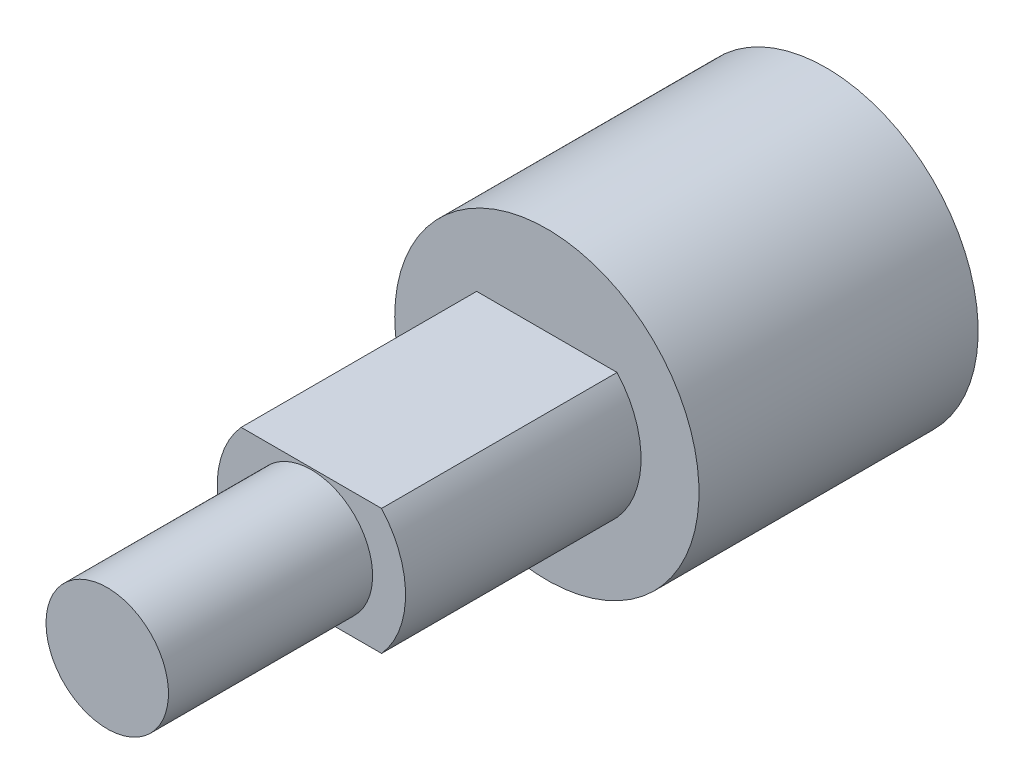
ISO-10303-21;
HEADER;
FILE_DESCRIPTION(('STEP AP214'),'2;1');
FILE_NAME('part.step','',(''),(''),'','','');
FILE_SCHEMA(('AUTOMOTIVE_DESIGN { 1 0 10303 214 1 1 1 1 }'));
ENDSEC;
DATA;
#1=APPLICATION_CONTEXT('core data for automotive mechanical design processes');
#2=APPLICATION_PROTOCOL_DEFINITION('international standard','automotive_design',2000,#1);
#3=PRODUCT_CONTEXT('',#1,'mechanical');
#4=PRODUCT('Part','Part','',(#3));
#5=PRODUCT_RELATED_PRODUCT_CATEGORY('part','',(#4));
#6=PRODUCT_DEFINITION_FORMATION('','',#4);
#7=PRODUCT_DEFINITION_CONTEXT('part definition',#1,'design');
#8=PRODUCT_DEFINITION('design','',#6,#7);
#9=PRODUCT_DEFINITION_SHAPE('','',#8);
#10=(LENGTH_UNIT() NAMED_UNIT(*) SI_UNIT(.MILLI.,.METRE.));
#11=(NAMED_UNIT(*) PLANE_ANGLE_UNIT() SI_UNIT($,.RADIAN.));
#12=(NAMED_UNIT(*) SI_UNIT($,.STERADIAN.) SOLID_ANGLE_UNIT());
#13=UNCERTAINTY_MEASURE_WITH_UNIT(LENGTH_MEASURE(1.E-05),#10,'distance_accuracy_value','');
#14=(GEOMETRIC_REPRESENTATION_CONTEXT(3) GLOBAL_UNCERTAINTY_ASSIGNED_CONTEXT((#13)) GLOBAL_UNIT_ASSIGNED_CONTEXT((#10,
#11,#12)) REPRESENTATION_CONTEXT('',''));
#15=CARTESIAN_POINT('',(0.,0.,0.));
#16=DIRECTION('',(0.,0.,1.));
#17=DIRECTION('',(1.,0.,0.));
#18=AXIS2_PLACEMENT_3D('',#15,#16,#17);
#19=CARTESIAN_POINT('',(0.,0.,16.39));
#20=DIRECTION('',(0.,0.,1.));
#21=DIRECTION('',(1.,0.,0.));
#22=AXIS2_PLACEMENT_3D('',#19,#20,#21);
#23=PLANE('',#22);
#24=CARTESIAN_POINT('',(0.,0.,16.39));
#25=DIRECTION('',(0.,0.,1.));
#26=DIRECTION('',(1.,0.,0.));
#27=AXIS2_PLACEMENT_3D('',#24,#25,#26);
#28=CIRCLE('',#27,3.);
#29=CARTESIAN_POINT('',(-2.23606797749979,2.,16.39));
#30=VERTEX_POINT('',#29);
#31=CARTESIAN_POINT('',(-2.23606797749979,-2.,16.39));
#32=VERTEX_POINT('',#31);
#33=EDGE_CURVE('E82',#30,#32,#28,.T.);
#34=ORIENTED_EDGE('',*,*,#33,.T.);
#35=DIRECTION('',(1.,0.,0.));
#36=VECTOR('',#35,1.);
#37=CARTESIAN_POINT('',(-2.23606797749979,-2.,16.39));
#38=LINE('',#37,#36);
#39=CARTESIAN_POINT('',(2.23606797749979,-2.,16.39));
#40=VERTEX_POINT('',#39);
#41=EDGE_CURVE('E77',#32,#40,#38,.T.);
#42=ORIENTED_EDGE('',*,*,#41,.T.);
#43=CARTESIAN_POINT('',(0.,0.,16.39));
#44=DIRECTION('',(0.,0.,1.));
#45=DIRECTION('',(1.,0.,0.));
#46=AXIS2_PLACEMENT_3D('',#43,#44,#45);
#47=CIRCLE('',#46,3.);
#48=CARTESIAN_POINT('',(2.23606797749979,2.,16.39));
#49=VERTEX_POINT('',#48);
#50=EDGE_CURVE('E80',#40,#49,#47,.T.);
#51=ORIENTED_EDGE('',*,*,#50,.T.);
#52=DIRECTION('',(-1.,0.,0.));
#53=VECTOR('',#52,1.);
#54=CARTESIAN_POINT('',(-2.23606797749979,2.,16.39));
#55=LINE('',#54,#53);
#56=EDGE_CURVE('E56',#49,#30,#55,.T.);
#57=ORIENTED_EDGE('',*,*,#56,.T.);
#58=EDGE_LOOP('',(#34,#42,#51,#57));
#59=FACE_BOUND('',#58,.T.);
#60=CARTESIAN_POINT('',(0.,0.,16.39));
#61=DIRECTION('',(0.,0.,1.));
#62=DIRECTION('',(1.,0.,0.));
#63=AXIS2_PLACEMENT_3D('',#60,#61,#62);
#64=CIRCLE('',#63,1.95);
#65=CARTESIAN_POINT('',(-1.95,0.,16.39));
#66=VERTEX_POINT('',#65);
#67=EDGE_CURVE('E161',#66,#66,#64,.T.);
#68=ORIENTED_EDGE('',*,*,#67,.F.);
#69=EDGE_LOOP('',(#68));
#70=FACE_BOUND('',#69,.T.);
#71=ADVANCED_FACE('F33',(#59,#70),#23,.T.);
#72=CARTESIAN_POINT('',(0.,0.,8.89));
#73=DIRECTION('',(0.,0.,1.));
#74=DIRECTION('',(1.,0.,0.));
#75=AXIS2_PLACEMENT_3D('',#72,#73,#74);
#76=PLANE('',#75);
#77=CARTESIAN_POINT('',(0.,0.,8.89));
#78=DIRECTION('',(0.,0.,1.));
#79=DIRECTION('',(1.,0.,0.));
#80=AXIS2_PLACEMENT_3D('',#77,#78,#79);
#81=CIRCLE('',#80,4.845);
#82=CARTESIAN_POINT('',(-4.845,0.,8.89));
#83=VERTEX_POINT('',#82);
#84=EDGE_CURVE('E11',#83,#83,#81,.T.);
#85=ORIENTED_EDGE('',*,*,#84,.T.);
#86=EDGE_LOOP('',(#85));
#87=FACE_BOUND('',#86,.T.);
#88=DIRECTION('',(1.,0.,0.));
#89=VECTOR('',#88,1.);
#90=CARTESIAN_POINT('',(-2.23606797749979,-2.,8.89));
#91=LINE('',#90,#89);
#92=CARTESIAN_POINT('',(-2.23606797749979,-2.,8.89));
#93=VERTEX_POINT('',#92);
#94=CARTESIAN_POINT('',(2.23606797749979,-2.,8.89));
#95=VERTEX_POINT('',#94);
#96=EDGE_CURVE('E89',#93,#95,#91,.T.);
#97=ORIENTED_EDGE('',*,*,#96,.F.);
#98=CARTESIAN_POINT('',(0.,0.,8.89));
#99=DIRECTION('',(0.,0.,1.));
#100=DIRECTION('',(1.,0.,0.));
#101=AXIS2_PLACEMENT_3D('',#98,#99,#100);
#102=CIRCLE('',#101,3.);
#103=CARTESIAN_POINT('',(-2.23606797749979,2.,8.89));
#104=VERTEX_POINT('',#103);
#105=EDGE_CURVE('E100',#104,#93,#102,.T.);
#106=ORIENTED_EDGE('',*,*,#105,.F.);
#107=DIRECTION('',(-1.,0.,0.));
#108=VECTOR('',#107,1.);
#109=CARTESIAN_POINT('',(-2.23606797749979,2.,8.89));
#110=LINE('',#109,#108);
#111=CARTESIAN_POINT('',(2.23606797749979,2.,8.89));
#112=VERTEX_POINT('',#111);
#113=EDGE_CURVE('E70',#112,#104,#110,.T.);
#114=ORIENTED_EDGE('',*,*,#113,.F.);
#115=CARTESIAN_POINT('',(0.,0.,8.89));
#116=DIRECTION('',(0.,0.,1.));
#117=DIRECTION('',(1.,0.,0.));
#118=AXIS2_PLACEMENT_3D('',#115,#116,#117);
#119=CIRCLE('',#118,3.);
#120=EDGE_CURVE('E105',#95,#112,#119,.T.);
#121=ORIENTED_EDGE('',*,*,#120,.F.);
#122=EDGE_LOOP('',(#97,#106,#114,#121));
#123=FACE_BOUND('',#122,.T.);
#124=ADVANCED_FACE('F121',(#87,#123),#76,.T.);
#125=CARTESIAN_POINT('',(0.,0.,0.));
#126=DIRECTION('',(0.,0.,1.));
#127=DIRECTION('',(1.,0.,0.));
#128=AXIS2_PLACEMENT_3D('',#125,#126,#127);
#129=PLANE('',#128);
#130=CARTESIAN_POINT('',(0.,0.,0.));
#131=DIRECTION('',(0.,0.,1.));
#132=DIRECTION('',(1.,0.,0.));
#133=AXIS2_PLACEMENT_3D('',#130,#131,#132);
#134=CIRCLE('',#133,4.845);
#135=CARTESIAN_POINT('',(-4.845,0.,0.));
#136=VERTEX_POINT('',#135);
#137=EDGE_CURVE('E37',#136,#136,#134,.T.);
#138=ORIENTED_EDGE('',*,*,#137,.F.);
#139=EDGE_LOOP('',(#138));
#140=FACE_BOUND('',#139,.T.);
#141=CARTESIAN_POINT('',(0.,0.,0.));
#142=DIRECTION('',(0.,0.,1.));
#143=DIRECTION('',(1.,0.,0.));
#144=AXIS2_PLACEMENT_3D('',#141,#142,#143);
#145=CIRCLE('',#144,1.5);
#146=CARTESIAN_POINT('',(-1.5,0.,0.));
#147=VERTEX_POINT('',#146);
#148=EDGE_CURVE('E111',#147,#147,#145,.T.);
#149=ORIENTED_EDGE('',*,*,#148,.T.);
#150=EDGE_LOOP('',(#149));
#151=FACE_BOUND('',#150,.T.);
#152=ADVANCED_FACE('F119',(#140,#151),#129,.F.);
#153=CARTESIAN_POINT('',(0.,0.,8.89));
#154=DIRECTION('',(0.,0.,-1.));
#155=DIRECTION('',(-1.,0.,0.));
#156=AXIS2_PLACEMENT_3D('',#153,#154,#155);
#157=CYLINDRICAL_SURFACE('',#156,4.845);
#158=CARTESIAN_POINT('',(-4.845,0.,8.89));
#159=CARTESIAN_POINT('',(-4.845,0.,8.79739583333333));
#160=CARTESIAN_POINT('',(-4.845,0.,8.70479166666667));
#161=CARTESIAN_POINT('',(-4.845,0.,8.51958333333333));
#162=CARTESIAN_POINT('',(-4.845,0.,8.42697916666667));
#163=CARTESIAN_POINT('',(-4.845,0.,8.24177083333333));
#164=CARTESIAN_POINT('',(-4.845,0.,8.14916666666667));
#165=CARTESIAN_POINT('',(-4.845,0.,7.96395833333333));
#166=CARTESIAN_POINT('',(-4.845,0.,7.87135416666667));
#167=CARTESIAN_POINT('',(-4.845,0.,7.68614583333333));
#168=CARTESIAN_POINT('',(-4.845,0.,7.59354166666667));
#169=CARTESIAN_POINT('',(-4.845,0.,7.40833333333333));
#170=CARTESIAN_POINT('',(-4.845,0.,7.31572916666667));
#171=CARTESIAN_POINT('',(-4.845,0.,7.13052083333333));
#172=CARTESIAN_POINT('',(-4.845,0.,7.03791666666667));
#173=CARTESIAN_POINT('',(-4.845,0.,6.85270833333333));
#174=CARTESIAN_POINT('',(-4.845,0.,6.76010416666667));
#175=CARTESIAN_POINT('',(-4.845,0.,6.57489583333333));
#176=CARTESIAN_POINT('',(-4.845,0.,6.48229166666667));
#177=CARTESIAN_POINT('',(-4.845,0.,6.29708333333333));
#178=CARTESIAN_POINT('',(-4.845,0.,6.20447916666667));
#179=CARTESIAN_POINT('',(-4.845,0.,6.01927083333333));
#180=CARTESIAN_POINT('',(-4.845,0.,5.92666666666667));
#181=CARTESIAN_POINT('',(-4.845,0.,5.74145833333333));
#182=CARTESIAN_POINT('',(-4.845,0.,5.64885416666667));
#183=CARTESIAN_POINT('',(-4.845,0.,5.46364583333333));
#184=CARTESIAN_POINT('',(-4.845,0.,5.37104166666667));
#185=CARTESIAN_POINT('',(-4.845,0.,5.18583333333333));
#186=CARTESIAN_POINT('',(-4.845,0.,5.09322916666667));
#187=CARTESIAN_POINT('',(-4.845,0.,4.90802083333333));
#188=CARTESIAN_POINT('',(-4.845,0.,4.81541666666667));
#189=CARTESIAN_POINT('',(-4.845,0.,4.63020833333333));
#190=CARTESIAN_POINT('',(-4.845,0.,4.53760416666667));
#191=CARTESIAN_POINT('',(-4.845,0.,4.35239583333333));
#192=CARTESIAN_POINT('',(-4.845,0.,4.25979166666667));
#193=CARTESIAN_POINT('',(-4.845,0.,4.07458333333333));
#194=CARTESIAN_POINT('',(-4.845,0.,3.98197916666667));
#195=CARTESIAN_POINT('',(-4.845,0.,3.79677083333333));
#196=CARTESIAN_POINT('',(-4.845,0.,3.70416666666667));
#197=CARTESIAN_POINT('',(-4.845,0.,3.51895833333333));
#198=CARTESIAN_POINT('',(-4.845,0.,3.42635416666667));
#199=CARTESIAN_POINT('',(-4.845,0.,3.24114583333333));
#200=CARTESIAN_POINT('',(-4.845,0.,3.14854166666667));
#201=CARTESIAN_POINT('',(-4.845,0.,2.96333333333333));
#202=CARTESIAN_POINT('',(-4.845,0.,2.87072916666667));
#203=CARTESIAN_POINT('',(-4.845,0.,2.68552083333333));
#204=CARTESIAN_POINT('',(-4.845,0.,2.59291666666667));
#205=CARTESIAN_POINT('',(-4.845,0.,2.40770833333333));
#206=CARTESIAN_POINT('',(-4.845,0.,2.31510416666667));
#207=CARTESIAN_POINT('',(-4.845,0.,2.12989583333333));
#208=CARTESIAN_POINT('',(-4.845,0.,2.03729166666667));
#209=CARTESIAN_POINT('',(-4.845,0.,1.85208333333333));
#210=CARTESIAN_POINT('',(-4.845,0.,1.75947916666667));
#211=CARTESIAN_POINT('',(-4.845,0.,1.57427083333333));
#212=CARTESIAN_POINT('',(-4.845,0.,1.48166666666667));
#213=CARTESIAN_POINT('',(-4.845,0.,1.29645833333333));
#214=CARTESIAN_POINT('',(-4.845,0.,1.20385416666667));
#215=CARTESIAN_POINT('',(-4.845,0.,1.01864583333333));
#216=CARTESIAN_POINT('',(-4.845,0.,0.926041666666667));
#217=CARTESIAN_POINT('',(-4.845,0.,0.740833333333334));
#218=CARTESIAN_POINT('',(-4.845,0.,0.648229166666667));
#219=CARTESIAN_POINT('',(-4.845,0.,0.463020833333334));
#220=CARTESIAN_POINT('',(-4.845,0.,0.370416666666667));
#221=CARTESIAN_POINT('',(-4.845,0.,0.185208333333334));
#222=CARTESIAN_POINT('',(-4.845,0.,0.0926041666666669));
#223=CARTESIAN_POINT('',(-4.845,0.,0.));
#224=B_SPLINE_CURVE_WITH_KNOTS('',3,(#158,#159,#160,#161,#162,#163,#164,#165,#166,#167,#168,
#169,#170,#171,#172,#173,#174,#175,#176,#177,#178,#179,#180,#181,#182,#183,#184,#185,#186,#187,
#188,#189,#190,#191,#192,#193,#194,#195,#196,#197,#198,#199,#200,#201,#202,#203,#204,#205,#206,
#207,#208,#209,#210,#211,#212,#213,#214,#215,#216,#217,#218,#219,#220,#221,#222,#223),
.UNSPECIFIED.,.F.,.F.,(4,2,2,2,2,2,2,2,2,2,2,2,2,2,2,2,2,2,2,2,2,2,2,2,2,2,2,2,2,2,2,2,4),(0.,
0.277812499999999,0.555624999999999,0.833437499999999,1.11125,1.3890625,1.666875,1.9446875,
2.2225,2.5003125,2.778125,3.0559375,3.33375,3.6115625,3.889375,4.1671875,4.445,4.7228125,
5.000625,5.2784375,5.55625,5.8340625,6.111875,6.3896875,6.6675,6.9453125,7.223125,7.5009375,
7.77875,8.0565625,8.334375,8.6121875,8.89),.UNSPECIFIED.);
#225=EDGE_CURVE('BSEAM35',#83,#136,#224,.T.);
#226=ORIENTED_EDGE('',*,*,#84,.F.);
#227=ORIENTED_EDGE('',*,*,#137,.T.);
#228=ORIENTED_EDGE('',*,*,#225,.T.);
#229=ORIENTED_EDGE('',*,*,#225,.F.);
#230=EDGE_LOOP('',(#226,#228,#227,#229));
#231=FACE_BOUND('',#230,.T.);
#232=ADVANCED_FACE('F35',(#231),#157,.T.);
#233=CARTESIAN_POINT('',(0.,0.,8.89));
#234=DIRECTION('',(0.,0.,-1.));
#235=DIRECTION('',(-1.,0.,0.));
#236=AXIS2_PLACEMENT_3D('',#233,#234,#235);
#237=CYLINDRICAL_SURFACE('',#236,1.5);
#238=CARTESIAN_POINT('',(0.,0.,16.39));
#239=DIRECTION('',(0.,0.,1.));
#240=DIRECTION('',(1.,0.,0.));
#241=AXIS2_PLACEMENT_3D('',#238,#239,#240);
#242=CIRCLE('',#241,1.5);
#243=CARTESIAN_POINT('',(-1.5,0.,16.39));
#244=VERTEX_POINT('',#243);
#245=EDGE_CURVE('E103',#244,#244,#242,.T.);
#246=CARTESIAN_POINT('',(-1.5,0.,0.));
#247=CARTESIAN_POINT('',(-1.5,0.,0.170729166666667));
#248=CARTESIAN_POINT('',(-1.5,0.,0.341458333333334));
#249=CARTESIAN_POINT('',(-1.5,0.,0.682916666666667));
#250=CARTESIAN_POINT('',(-1.5,0.,0.853645833333334));
#251=CARTESIAN_POINT('',(-1.5,0.,1.19510416666667));
#252=CARTESIAN_POINT('',(-1.5,0.,1.36583333333333));
#253=CARTESIAN_POINT('',(-1.5,0.,1.70729166666667));
#254=CARTESIAN_POINT('',(-1.5,0.,1.87802083333333));
#255=CARTESIAN_POINT('',(-1.5,0.,2.21947916666667));
#256=CARTESIAN_POINT('',(-1.5,0.,2.39020833333333));
#257=CARTESIAN_POINT('',(-1.5,0.,2.73166666666667));
#258=CARTESIAN_POINT('',(-1.5,0.,2.90239583333333));
#259=CARTESIAN_POINT('',(-1.5,0.,3.24385416666667));
#260=CARTESIAN_POINT('',(-1.5,0.,3.41458333333333));
#261=CARTESIAN_POINT('',(-1.5,0.,3.75604166666667));
#262=CARTESIAN_POINT('',(-1.5,0.,3.92677083333333));
#263=CARTESIAN_POINT('',(-1.5,0.,4.26822916666667));
#264=CARTESIAN_POINT('',(-1.5,0.,4.43895833333333));
#265=CARTESIAN_POINT('',(-1.5,0.,4.78041666666667));
#266=CARTESIAN_POINT('',(-1.5,0.,4.95114583333333));
#267=CARTESIAN_POINT('',(-1.5,0.,5.29260416666667));
#268=CARTESIAN_POINT('',(-1.5,0.,5.46333333333333));
#269=CARTESIAN_POINT('',(-1.5,0.,5.80479166666667));
#270=CARTESIAN_POINT('',(-1.5,0.,5.97552083333333));
#271=CARTESIAN_POINT('',(-1.5,0.,6.31697916666667));
#272=CARTESIAN_POINT('',(-1.5,0.,6.48770833333333));
#273=CARTESIAN_POINT('',(-1.5,0.,6.82916666666667));
#274=CARTESIAN_POINT('',(-1.5,0.,6.99989583333333));
#275=CARTESIAN_POINT('',(-1.5,0.,7.34135416666667));
#276=CARTESIAN_POINT('',(-1.5,0.,7.51208333333333));
#277=CARTESIAN_POINT('',(-1.5,0.,7.85354166666666));
#278=CARTESIAN_POINT('',(-1.5,0.,8.02427083333333));
#279=CARTESIAN_POINT('',(-1.5,0.,8.36572916666667));
#280=CARTESIAN_POINT('',(-1.5,0.,8.53645833333333));
#281=CARTESIAN_POINT('',(-1.5,0.,8.87791666666667));
#282=CARTESIAN_POINT('',(-1.5,0.,9.04864583333333));
#283=CARTESIAN_POINT('',(-1.5,0.,9.39010416666667));
#284=CARTESIAN_POINT('',(-1.5,0.,9.56083333333333));
#285=CARTESIAN_POINT('',(-1.5,0.,9.90229166666666));
#286=CARTESIAN_POINT('',(-1.5,0.,10.0730208333333));
#287=CARTESIAN_POINT('',(-1.5,0.,10.4144791666667));
#288=CARTESIAN_POINT('',(-1.5,0.,10.5852083333333));
#289=CARTESIAN_POINT('',(-1.5,0.,10.9266666666667));
#290=CARTESIAN_POINT('',(-1.5,0.,11.0973958333333));
#291=CARTESIAN_POINT('',(-1.5,0.,11.4388541666667));
#292=CARTESIAN_POINT('',(-1.5,0.,11.6095833333333));
#293=CARTESIAN_POINT('',(-1.5,0.,11.9510416666667));
#294=CARTESIAN_POINT('',(-1.5,0.,12.1217708333333));
#295=CARTESIAN_POINT('',(-1.5,0.,12.4632291666667));
#296=CARTESIAN_POINT('',(-1.5,0.,12.6339583333333));
#297=CARTESIAN_POINT('',(-1.5,0.,12.9754166666667));
#298=CARTESIAN_POINT('',(-1.5,0.,13.1461458333333));
#299=CARTESIAN_POINT('',(-1.5,0.,13.4876041666667));
#300=CARTESIAN_POINT('',(-1.5,0.,13.6583333333333));
#301=CARTESIAN_POINT('',(-1.5,0.,13.9997916666667));
#302=CARTESIAN_POINT('',(-1.5,0.,14.1705208333333));
#303=CARTESIAN_POINT('',(-1.5,0.,14.5119791666667));
#304=CARTESIAN_POINT('',(-1.5,0.,14.6827083333333));
#305=CARTESIAN_POINT('',(-1.5,0.,15.0241666666667));
#306=CARTESIAN_POINT('',(-1.5,0.,15.1948958333333));
#307=CARTESIAN_POINT('',(-1.5,0.,15.5363541666667));
#308=CARTESIAN_POINT('',(-1.5,0.,15.7070833333333));
#309=CARTESIAN_POINT('',(-1.5,0.,16.0485416666667));
#310=CARTESIAN_POINT('',(-1.5,0.,16.2192708333333));
#311=CARTESIAN_POINT('',(-1.5,0.,16.39));
#312=B_SPLINE_CURVE_WITH_KNOTS('',3,(#246,#247,#248,#249,#250,#251,#252,#253,#254,#255,#256,
#257,#258,#259,#260,#261,#262,#263,#264,#265,#266,#267,#268,#269,#270,#271,#272,#273,#274,#275,
#276,#277,#278,#279,#280,#281,#282,#283,#284,#285,#286,#287,#288,#289,#290,#291,#292,#293,#294,
#295,#296,#297,#298,#299,#300,#301,#302,#303,#304,#305,#306,#307,#308,#309,#310,#311),
.UNSPECIFIED.,.F.,.F.,(4,2,2,2,2,2,2,2,2,2,2,2,2,2,2,2,2,2,2,2,2,2,2,2,2,2,2,2,2,2,2,2,4),(0.,
0.5121875,1.024375,1.5365625,2.04875,2.5609375,3.073125,3.5853125,4.0975,4.6096875,5.121875,
5.6340625,6.14625,6.6584375,7.170625,7.6828125,8.195,8.7071875,9.219375,9.7315625,10.24375,
10.7559375,11.268125,11.7803125,12.2925,12.8046875,13.316875,13.8290625,14.34125,14.8534375,
15.365625,15.8778125,16.39),.UNSPECIFIED.);
#313=EDGE_CURVE('BSEAM126',#147,#244,#312,.T.);
#314=ORIENTED_EDGE('',*,*,#148,.F.);
#315=ORIENTED_EDGE('',*,*,#245,.T.);
#316=ORIENTED_EDGE('',*,*,#313,.T.);
#317=ORIENTED_EDGE('',*,*,#313,.F.);
#318=EDGE_LOOP('',(#314,#316,#315,#317));
#319=FACE_BOUND('',#318,.T.);
#320=ADVANCED_FACE('F126',(#319),#237,.F.);
#321=CARTESIAN_POINT('',(0.,0.,16.39));
#322=DIRECTION('',(0.,0.,-1.));
#323=DIRECTION('',(-1.,0.,0.));
#324=AXIS2_PLACEMENT_3D('',#321,#322,#323);
#325=CYLINDRICAL_SURFACE('',#324,3.);
#326=ORIENTED_EDGE('',*,*,#105,.T.);
#327=DIRECTION('',(0.,0.,-1.));
#328=VECTOR('',#327,1.);
#329=CARTESIAN_POINT('',(-2.23606797749979,-2.,16.39));
#330=LINE('',#329,#328);
#331=EDGE_CURVE('E92',#32,#93,#330,.T.);
#332=ORIENTED_EDGE('',*,*,#331,.F.);
#333=ORIENTED_EDGE('',*,*,#33,.F.);
#334=DIRECTION('',(0.,0.,-1.));
#335=VECTOR('',#334,1.);
#336=CARTESIAN_POINT('',(-2.23606797749979,2.,16.39));
#337=LINE('',#336,#335);
#338=EDGE_CURVE('E96',#30,#104,#337,.T.);
#339=ORIENTED_EDGE('',*,*,#338,.T.);
#340=EDGE_LOOP('',(#326,#332,#333,#339));
#341=FACE_BOUND('',#340,.T.);
#342=ADVANCED_FACE('F146',(#341),#325,.T.);
#343=CARTESIAN_POINT('',(-2.23606797749979,-2.,16.39));
#344=DIRECTION('',(0.,1.,0.));
#345=DIRECTION('',(0.,0.,1.));
#346=AXIS2_PLACEMENT_3D('',#343,#344,#345);
#347=PLANE('',#346);
#348=ORIENTED_EDGE('',*,*,#96,.T.);
#349=DIRECTION('',(0.,0.,-1.));
#350=VECTOR('',#349,1.);
#351=CARTESIAN_POINT('',(2.23606797749979,-2.,16.39));
#352=LINE('',#351,#350);
#353=EDGE_CURVE('E86',#40,#95,#352,.T.);
#354=ORIENTED_EDGE('',*,*,#353,.F.);
#355=ORIENTED_EDGE('',*,*,#41,.F.);
#356=ORIENTED_EDGE('',*,*,#331,.T.);
#357=EDGE_LOOP('',(#348,#354,#355,#356));
#358=FACE_BOUND('',#357,.T.);
#359=ADVANCED_FACE('F87',(#358),#347,.F.);
#360=CARTESIAN_POINT('',(0.,0.,16.39));
#361=DIRECTION('',(0.,0.,-1.));
#362=DIRECTION('',(-1.,0.,0.));
#363=AXIS2_PLACEMENT_3D('',#360,#361,#362);
#364=CYLINDRICAL_SURFACE('',#363,3.);
#365=ORIENTED_EDGE('',*,*,#120,.T.);
#366=DIRECTION('',(0.,0.,-1.));
#367=VECTOR('',#366,1.);
#368=CARTESIAN_POINT('',(2.23606797749979,2.,16.39));
#369=LINE('',#368,#367);
#370=EDGE_CURVE('E48',#49,#112,#369,.T.);
#371=ORIENTED_EDGE('',*,*,#370,.F.);
#372=ORIENTED_EDGE('',*,*,#50,.F.);
#373=ORIENTED_EDGE('',*,*,#353,.T.);
#374=EDGE_LOOP('',(#365,#371,#372,#373));
#375=FACE_BOUND('',#374,.T.);
#376=ADVANCED_FACE('F94',(#375),#364,.T.);
#377=CARTESIAN_POINT('',(-2.23606797749979,2.,16.39));
#378=DIRECTION('',(0.,-1.,0.));
#379=DIRECTION('',(0.,0.,-1.));
#380=AXIS2_PLACEMENT_3D('',#377,#378,#379);
#381=PLANE('',#380);
#382=ORIENTED_EDGE('',*,*,#113,.T.);
#383=ORIENTED_EDGE('',*,*,#338,.F.);
#384=ORIENTED_EDGE('',*,*,#56,.F.);
#385=ORIENTED_EDGE('',*,*,#370,.T.);
#386=EDGE_LOOP('',(#382,#383,#384,#385));
#387=FACE_BOUND('',#386,.T.);
#388=ADVANCED_FACE('F138',(#387),#381,.F.);
#389=CARTESIAN_POINT('',(0.,0.,22.89));
#390=DIRECTION('',(0.,0.,1.));
#391=DIRECTION('',(1.,0.,0.));
#392=AXIS2_PLACEMENT_3D('',#389,#390,#391);
#393=PLANE('',#392);
#394=CARTESIAN_POINT('',(0.,0.,22.89));
#395=DIRECTION('',(0.,0.,1.));
#396=DIRECTION('',(1.,0.,0.));
#397=AXIS2_PLACEMENT_3D('',#394,#395,#396);
#398=CIRCLE('',#397,1.95);
#399=CARTESIAN_POINT('',(-1.95,0.,22.89));
#400=VERTEX_POINT('',#399);
#401=EDGE_CURVE('E158',#400,#400,#398,.T.);
#402=ORIENTED_EDGE('',*,*,#401,.T.);
#403=EDGE_LOOP('',(#402));
#404=FACE_BOUND('',#403,.T.);
#405=ADVANCED_FACE('F141',(#404),#393,.T.);
#406=CARTESIAN_POINT('',(0.,0.,22.89));
#407=DIRECTION('',(0.,0.,-1.));
#408=DIRECTION('',(-1.,0.,0.));
#409=AXIS2_PLACEMENT_3D('',#406,#407,#408);
#410=CYLINDRICAL_SURFACE('',#409,1.95);
#411=CARTESIAN_POINT('',(-1.95,0.,22.89));
#412=CARTESIAN_POINT('',(-1.95,0.,22.8222916666667));
#413=CARTESIAN_POINT('',(-1.95,0.,22.7545833333333));
#414=CARTESIAN_POINT('',(-1.95,0.,22.6191666666667));
#415=CARTESIAN_POINT('',(-1.95,0.,22.5514583333333));
#416=CARTESIAN_POINT('',(-1.95,0.,22.4160416666667));
#417=CARTESIAN_POINT('',(-1.95,0.,22.3483333333333));
#418=CARTESIAN_POINT('',(-1.95,0.,22.2129166666667));
#419=CARTESIAN_POINT('',(-1.95,0.,22.1452083333333));
#420=CARTESIAN_POINT('',(-1.95,0.,22.0097916666667));
#421=CARTESIAN_POINT('',(-1.95,0.,21.9420833333333));
#422=CARTESIAN_POINT('',(-1.95,0.,21.8066666666667));
#423=CARTESIAN_POINT('',(-1.95,0.,21.7389583333333));
#424=CARTESIAN_POINT('',(-1.95,0.,21.6035416666667));
#425=CARTESIAN_POINT('',(-1.95,0.,21.5358333333333));
#426=CARTESIAN_POINT('',(-1.95,0.,21.4004166666667));
#427=CARTESIAN_POINT('',(-1.95,0.,21.3327083333333));
#428=CARTESIAN_POINT('',(-1.95,0.,21.1972916666667));
#429=CARTESIAN_POINT('',(-1.95,0.,21.1295833333333));
#430=CARTESIAN_POINT('',(-1.95,0.,20.9941666666667));
#431=CARTESIAN_POINT('',(-1.95,0.,20.9264583333333));
#432=CARTESIAN_POINT('',(-1.95,0.,20.7910416666667));
#433=CARTESIAN_POINT('',(-1.95,0.,20.7233333333333));
#434=CARTESIAN_POINT('',(-1.95,0.,20.5879166666667));
#435=CARTESIAN_POINT('',(-1.95,0.,20.5202083333333));
#436=CARTESIAN_POINT('',(-1.95,0.,20.3847916666667));
#437=CARTESIAN_POINT('',(-1.95,0.,20.3170833333333));
#438=CARTESIAN_POINT('',(-1.95,0.,20.1816666666667));
#439=CARTESIAN_POINT('',(-1.95,0.,20.1139583333333));
#440=CARTESIAN_POINT('',(-1.95,0.,19.9785416666667));
#441=CARTESIAN_POINT('',(-1.95,0.,19.9108333333333));
#442=CARTESIAN_POINT('',(-1.95,0.,19.7754166666667));
#443=CARTESIAN_POINT('',(-1.95,0.,19.7077083333333));
#444=CARTESIAN_POINT('',(-1.95,0.,19.5722916666667));
#445=CARTESIAN_POINT('',(-1.95,0.,19.5045833333333));
#446=CARTESIAN_POINT('',(-1.95,0.,19.3691666666667));
#447=CARTESIAN_POINT('',(-1.95,0.,19.3014583333333));
#448=CARTESIAN_POINT('',(-1.95,0.,19.1660416666667));
#449=CARTESIAN_POINT('',(-1.95,0.,19.0983333333333));
#450=CARTESIAN_POINT('',(-1.95,0.,18.9629166666667));
#451=CARTESIAN_POINT('',(-1.95,0.,18.8952083333333));
#452=CARTESIAN_POINT('',(-1.95,0.,18.7597916666667));
#453=CARTESIAN_POINT('',(-1.95,0.,18.6920833333333));
#454=CARTESIAN_POINT('',(-1.95,0.,18.5566666666667));
#455=CARTESIAN_POINT('',(-1.95,0.,18.4889583333333));
#456=CARTESIAN_POINT('',(-1.95,0.,18.3535416666667));
#457=CARTESIAN_POINT('',(-1.95,0.,18.2858333333333));
#458=CARTESIAN_POINT('',(-1.95,0.,18.1504166666667));
#459=CARTESIAN_POINT('',(-1.95,0.,18.0827083333333));
#460=CARTESIAN_POINT('',(-1.95,0.,17.9472916666667));
#461=CARTESIAN_POINT('',(-1.95,0.,17.8795833333333));
#462=CARTESIAN_POINT('',(-1.95,0.,17.7441666666667));
#463=CARTESIAN_POINT('',(-1.95,0.,17.6764583333333));
#464=CARTESIAN_POINT('',(-1.95,0.,17.5410416666667));
#465=CARTESIAN_POINT('',(-1.95,0.,17.4733333333333));
#466=CARTESIAN_POINT('',(-1.95,0.,17.3379166666667));
#467=CARTESIAN_POINT('',(-1.95,0.,17.2702083333333));
#468=CARTESIAN_POINT('',(-1.95,0.,17.1347916666667));
#469=CARTESIAN_POINT('',(-1.95,0.,17.0670833333333));
#470=CARTESIAN_POINT('',(-1.95,0.,16.9316666666667));
#471=CARTESIAN_POINT('',(-1.95,0.,16.8639583333333));
#472=CARTESIAN_POINT('',(-1.95,0.,16.7285416666667));
#473=CARTESIAN_POINT('',(-1.95,0.,16.6608333333333));
#474=CARTESIAN_POINT('',(-1.95,0.,16.5254166666667));
#475=CARTESIAN_POINT('',(-1.95,0.,16.4577083333333));
#476=CARTESIAN_POINT('',(-1.95,0.,16.39));
#477=B_SPLINE_CURVE_WITH_KNOTS('',3,(#411,#412,#413,#414,#415,#416,#417,#418,#419,#420,#421,
#422,#423,#424,#425,#426,#427,#428,#429,#430,#431,#432,#433,#434,#435,#436,#437,#438,#439,#440,
#441,#442,#443,#444,#445,#446,#447,#448,#449,#450,#451,#452,#453,#454,#455,#456,#457,#458,#459,
#460,#461,#462,#463,#464,#465,#466,#467,#468,#469,#470,#471,#472,#473,#474,#475,#476),
.UNSPECIFIED.,.F.,.F.,(4,2,2,2,2,2,2,2,2,2,2,2,2,2,2,2,2,2,2,2,2,2,2,2,2,2,2,2,2,2,2,2,4),(0.,
0.203124999999998,0.406249999999997,0.609374999999999,0.812499999999997,1.015625,1.21875,
1.421875,1.625,1.828125,2.03125,2.234375,2.4375,2.640625,2.84375,3.046875,3.25,3.453125,3.65625,
3.859375,4.0625,4.265625,4.46875,4.671875,4.875,5.078125,5.28125,5.484375,5.6875,5.890625,
6.09375,6.296875,6.5),.UNSPECIFIED.);
#478=EDGE_CURVE('BSEAM136',#400,#66,#477,.T.);
#479=ORIENTED_EDGE('',*,*,#401,.F.);
#480=ORIENTED_EDGE('',*,*,#67,.T.);
#481=ORIENTED_EDGE('',*,*,#478,.T.);
#482=ORIENTED_EDGE('',*,*,#478,.F.);
#483=EDGE_LOOP('',(#479,#481,#480,#482));
#484=FACE_BOUND('',#483,.T.);
#485=ADVANCED_FACE('F136',(#484),#410,.T.);
#486=CARTESIAN_POINT('',(0.,0.,16.39));
#487=DIRECTION('',(0.,0.,1.));
#488=DIRECTION('',(1.,0.,0.));
#489=AXIS2_PLACEMENT_3D('',#486,#487,#488);
#490=PLANE('',#489);
#491=ORIENTED_EDGE('',*,*,#245,.F.);
#492=EDGE_LOOP('',(#491));
#493=FACE_BOUND('',#492,.T.);
#494=ADVANCED_FACE('F168',(#493),#490,.F.);
#495=CLOSED_SHELL('',(#71,#124,#152,#232,#320,#342,#359,#376,#388,#405,#485,#494));
#496=MANIFOLD_SOLID_BREP('B2',#495);
#497=ADVANCED_BREP_SHAPE_REPRESENTATION('',(#18,#496),#14);
#498=SHAPE_DEFINITION_REPRESENTATION(#9,#497);
ENDSEC;
END-ISO-10303-21;
